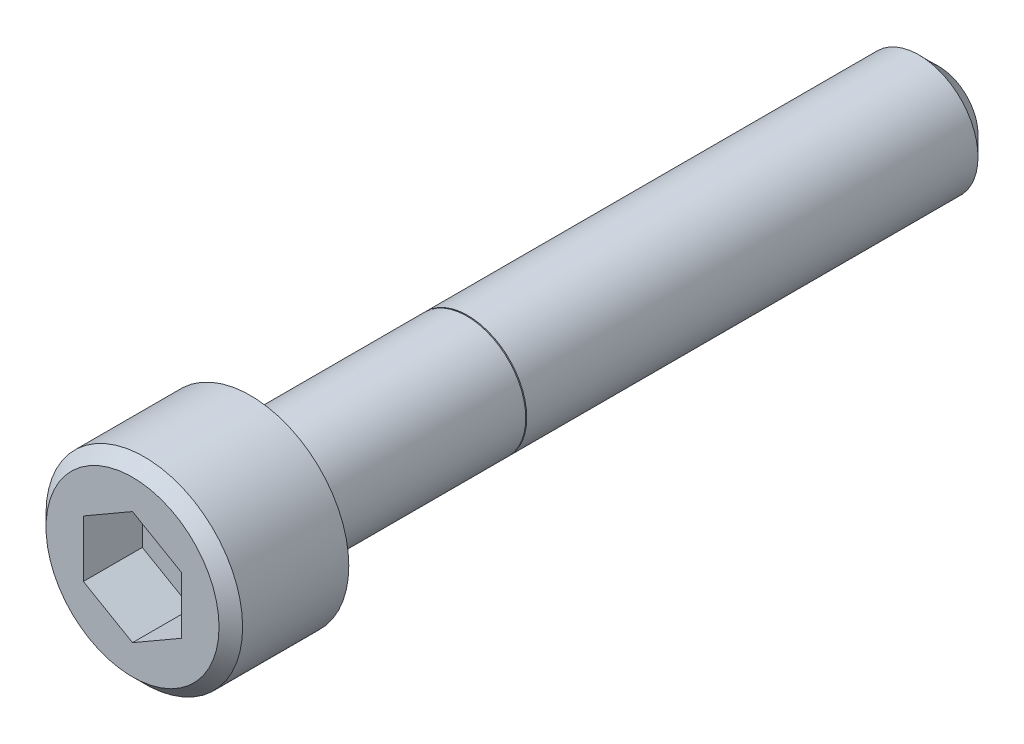
ISO-10303-21;
HEADER;
FILE_DESCRIPTION(('STEP AP214'),'2;1');
FILE_NAME('part.step','',(''),(''),'','','');
FILE_SCHEMA(('AUTOMOTIVE_DESIGN { 1 0 10303 214 1 1 1 1 }'));
ENDSEC;
DATA;
#1=APPLICATION_CONTEXT('core data for automotive mechanical design processes');
#2=APPLICATION_PROTOCOL_DEFINITION('international standard','automotive_design',2000,#1);
#3=PRODUCT_CONTEXT('',#1,'mechanical');
#4=PRODUCT('Part','Part','',(#3));
#5=PRODUCT_RELATED_PRODUCT_CATEGORY('part','',(#4));
#6=PRODUCT_DEFINITION_FORMATION('','',#4);
#7=PRODUCT_DEFINITION_CONTEXT('part definition',#1,'design');
#8=PRODUCT_DEFINITION('design','',#6,#7);
#9=PRODUCT_DEFINITION_SHAPE('','',#8);
#10=(LENGTH_UNIT() NAMED_UNIT(*) SI_UNIT(.MILLI.,.METRE.));
#11=(NAMED_UNIT(*) PLANE_ANGLE_UNIT() SI_UNIT($,.RADIAN.));
#12=(NAMED_UNIT(*) SI_UNIT($,.STERADIAN.) SOLID_ANGLE_UNIT());
#13=UNCERTAINTY_MEASURE_WITH_UNIT(LENGTH_MEASURE(1.E-05),#10,'distance_accuracy_value','');
#14=(GEOMETRIC_REPRESENTATION_CONTEXT(3) GLOBAL_UNCERTAINTY_ASSIGNED_CONTEXT((#13)) GLOBAL_UNIT_ASSIGNED_CONTEXT((#10,
#11,#12)) REPRESENTATION_CONTEXT('',''));
#15=CARTESIAN_POINT('',(0.,0.,0.));
#16=DIRECTION('',(0.,0.,1.));
#17=DIRECTION('',(1.,0.,0.));
#18=AXIS2_PLACEMENT_3D('',#15,#16,#17);
#19=CARTESIAN_POINT('',(0.,0.,54.));
#20=DIRECTION('',(0.,0.,1.));
#21=DIRECTION('',(1.,0.,0.));
#22=AXIS2_PLACEMENT_3D('',#19,#20,#21);
#23=CYLINDRICAL_SURFACE('',#22,3.);
#24=CARTESIAN_POINT('',(0.,0.,0.));
#25=DIRECTION('',(0.,0.,1.));
#26=DIRECTION('',(1.,0.,0.));
#27=AXIS2_PLACEMENT_3D('',#24,#25,#26);
#28=CIRCLE('',#27,3.);
#29=CARTESIAN_POINT('',(3.,0.,0.));
#30=VERTEX_POINT('',#29);
#31=EDGE_CURVE('E135',#30,#30,#28,.T.);
#32=ORIENTED_EDGE('',*,*,#31,.F.);
#33=EDGE_LOOP('',(#32));
#34=FACE_BOUND('',#33,.T.);
#35=CARTESIAN_POINT('',(0.,0.,-11.));
#36=DIRECTION('',(0.,0.,1.));
#37=DIRECTION('',(1.,0.,0.));
#38=AXIS2_PLACEMENT_3D('',#35,#36,#37);
#39=CIRCLE('',#38,3.);
#40=CARTESIAN_POINT('',(3.,0.,-11.));
#41=VERTEX_POINT('',#40);
#42=EDGE_CURVE('E121',#41,#41,#39,.T.);
#43=ORIENTED_EDGE('',*,*,#42,.T.);
#44=EDGE_LOOP('',(#43));
#45=FACE_BOUND('',#44,.T.);
#46=ADVANCED_FACE('F15',(#34,#45),#23,.T.);
#47=CARTESIAN_POINT('',(0.,0.,6.));
#48=DIRECTION('',(0.,0.,1.));
#49=DIRECTION('',(1.,0.,0.));
#50=AXIS2_PLACEMENT_3D('',#47,#48,#49);
#51=PLANE('',#50);
#52=CARTESIAN_POINT('',(0.,0.,6.));
#53=DIRECTION('',(0.,0.,1.));
#54=DIRECTION('',(1.,0.,0.));
#55=AXIS2_PLACEMENT_3D('',#52,#53,#54);
#56=CIRCLE('',#55,4.4);
#57=CARTESIAN_POINT('',(4.4,0.,6.));
#58=VERTEX_POINT('',#57);
#59=EDGE_CURVE('E9',#58,#58,#56,.T.);
#60=ORIENTED_EDGE('',*,*,#59,.T.);
#61=EDGE_LOOP('',(#60));
#62=FACE_BOUND('',#61,.T.);
#63=DIRECTION('',(0.,-1.,0.));
#64=VECTOR('',#63,1.);
#65=CARTESIAN_POINT('',(2.5,1.44337567297406,6.));
#66=LINE('',#65,#64);
#67=CARTESIAN_POINT('',(2.5,1.44337567297406,6.));
#68=VERTEX_POINT('',#67);
#69=CARTESIAN_POINT('',(2.5,-1.44337567297406,6.));
#70=VERTEX_POINT('',#69);
#71=EDGE_CURVE('E102',#68,#70,#66,.T.);
#72=ORIENTED_EDGE('',*,*,#71,.T.);
#73=DIRECTION('',(-0.866025403784439,-0.5,0.));
#74=VECTOR('',#73,1.);
#75=CARTESIAN_POINT('',(2.5,-1.44337567297406,6.));
#76=LINE('',#75,#74);
#77=CARTESIAN_POINT('',(0.,-2.88675134594813,6.));
#78=VERTEX_POINT('',#77);
#79=EDGE_CURVE('E30',#70,#78,#76,.T.);
#80=ORIENTED_EDGE('',*,*,#79,.T.);
#81=DIRECTION('',(-0.866025403784438,0.5,0.));
#82=VECTOR('',#81,1.);
#83=CARTESIAN_POINT('',(0.,-2.88675134594813,6.));
#84=LINE('',#83,#82);
#85=CARTESIAN_POINT('',(-2.49999999999999,-1.44337567297406,6.));
#86=VERTEX_POINT('',#85);
#87=EDGE_CURVE('E103',#78,#86,#84,.T.);
#88=ORIENTED_EDGE('',*,*,#87,.T.);
#89=DIRECTION('',(0.,1.,0.));
#90=VECTOR('',#89,1.);
#91=CARTESIAN_POINT('',(-2.5,-1.44337567297406,6.));
#92=LINE('',#91,#90);
#93=CARTESIAN_POINT('',(-2.5,1.44337567297406,6.));
#94=VERTEX_POINT('',#93);
#95=EDGE_CURVE('E107',#86,#94,#92,.T.);
#96=ORIENTED_EDGE('',*,*,#95,.T.);
#97=DIRECTION('',(0.866025403784439,0.5,0.));
#98=VECTOR('',#97,1.);
#99=CARTESIAN_POINT('',(-2.49999999999999,1.44337567297406,6.));
#100=LINE('',#99,#98);
#101=CARTESIAN_POINT('',(0.,2.88675134594813,6.));
#102=VERTEX_POINT('',#101);
#103=EDGE_CURVE('E111',#94,#102,#100,.T.);
#104=ORIENTED_EDGE('',*,*,#103,.T.);
#105=DIRECTION('',(0.866025403784438,-0.5,0.));
#106=VECTOR('',#105,1.);
#107=CARTESIAN_POINT('',(0.,2.88675134594813,6.));
#108=LINE('',#107,#106);
#109=EDGE_CURVE('E91',#102,#68,#108,.T.);
#110=ORIENTED_EDGE('',*,*,#109,.T.);
#111=EDGE_LOOP('',(#72,#80,#88,#96,#104,#110));
#112=FACE_BOUND('',#111,.T.);
#113=ADVANCED_FACE('F17',(#62,#112),#51,.T.);
#114=CARTESIAN_POINT('',(0.,0.,6.));
#115=DIRECTION('',(0.,0.,-1.));
#116=DIRECTION('',(-1.,0.,0.));
#117=AXIS2_PLACEMENT_3D('',#114,#115,#116);
#118=CONICAL_SURFACE('',#117,4.4,0.785398163397451);
#119=CARTESIAN_POINT('',(0.,0.,5.4));
#120=DIRECTION('',(0.,0.,1.));
#121=DIRECTION('',(1.,0.,0.));
#122=AXIS2_PLACEMENT_3D('',#119,#120,#121);
#123=CIRCLE('',#122,5.);
#124=CARTESIAN_POINT('',(5.,0.,5.4));
#125=VERTEX_POINT('',#124);
#126=EDGE_CURVE('E23',#125,#125,#123,.T.);
#127=ORIENTED_EDGE('',*,*,#126,.T.);
#128=EDGE_LOOP('',(#127));
#129=FACE_BOUND('',#128,.T.);
#130=ORIENTED_EDGE('',*,*,#59,.F.);
#131=EDGE_LOOP('',(#130));
#132=FACE_BOUND('',#131,.T.);
#133=ADVANCED_FACE('F143',(#129,#132),#118,.T.);
#134=CARTESIAN_POINT('',(0.,0.,54.));
#135=DIRECTION('',(0.,0.,1.));
#136=DIRECTION('',(1.,0.,0.));
#137=AXIS2_PLACEMENT_3D('',#134,#135,#136);
#138=CYLINDRICAL_SURFACE('',#137,5.);
#139=CARTESIAN_POINT('',(0.,0.,0.));
#140=DIRECTION('',(0.,0.,1.));
#141=DIRECTION('',(1.,0.,0.));
#142=AXIS2_PLACEMENT_3D('',#139,#140,#141);
#143=CIRCLE('',#142,5.);
#144=CARTESIAN_POINT('',(5.,0.,0.));
#145=VERTEX_POINT('',#144);
#146=EDGE_CURVE('E138',#145,#145,#143,.T.);
#147=ORIENTED_EDGE('',*,*,#146,.T.);
#148=EDGE_LOOP('',(#147));
#149=FACE_BOUND('',#148,.T.);
#150=ORIENTED_EDGE('',*,*,#126,.F.);
#151=EDGE_LOOP('',(#150));
#152=FACE_BOUND('',#151,.T.);
#153=ADVANCED_FACE('F146',(#149,#152),#138,.T.);
#154=CARTESIAN_POINT('',(5.,0.,0.));
#155=DIRECTION('',(0.,0.,-1.));
#156=DIRECTION('',(-1.,0.,0.));
#157=AXIS2_PLACEMENT_3D('',#154,#155,#156);
#158=PLANE('',#157);
#159=ORIENTED_EDGE('',*,*,#31,.T.);
#160=EDGE_LOOP('',(#159));
#161=FACE_BOUND('',#160,.T.);
#162=ORIENTED_EDGE('',*,*,#146,.F.);
#163=EDGE_LOOP('',(#162));
#164=FACE_BOUND('',#163,.T.);
#165=ADVANCED_FACE('F148',(#161,#164),#158,.T.);
#166=CARTESIAN_POINT('',(2.5,-1.44337567297406,3.));
#167=DIRECTION('',(-0.5,0.866025403784438,0.));
#168=DIRECTION('',(-0.866025403784439,-0.5,0.));
#169=AXIS2_PLACEMENT_3D('',#166,#167,#168);
#170=PLANE('',#169);
#171=ORIENTED_EDGE('',*,*,#79,.F.);
#172=DIRECTION('',(0.,0.,1.));
#173=VECTOR('',#172,1.);
#174=CARTESIAN_POINT('',(2.5,-1.44337567297406,3.));
#175=LINE('',#174,#173);
#176=CARTESIAN_POINT('',(2.5,-1.44337567297406,3.));
#177=VERTEX_POINT('',#176);
#178=EDGE_CURVE('E96',#177,#70,#175,.T.);
#179=ORIENTED_EDGE('',*,*,#178,.F.);
#180=DIRECTION('',(-0.866025403784439,-0.5,0.));
#181=VECTOR('',#180,1.);
#182=CARTESIAN_POINT('',(2.5,-1.44337567297406,3.));
#183=LINE('',#182,#181);
#184=CARTESIAN_POINT('',(0.,-2.88675134594813,3.));
#185=VERTEX_POINT('',#184);
#186=EDGE_CURVE('E100',#177,#185,#183,.T.);
#187=ORIENTED_EDGE('',*,*,#186,.T.);
#188=DIRECTION('',(0.,0.,1.));
#189=VECTOR('',#188,1.);
#190=CARTESIAN_POINT('',(0.,-2.88675134594813,3.));
#191=LINE('',#190,#189);
#192=EDGE_CURVE('E127',#185,#78,#191,.T.);
#193=ORIENTED_EDGE('',*,*,#192,.T.);
#194=EDGE_LOOP('',(#171,#179,#187,#193));
#195=FACE_BOUND('',#194,.T.);
#196=ADVANCED_FACE('F156',(#195),#170,.T.);
#197=CARTESIAN_POINT('',(0.,-2.88675134594813,3.));
#198=DIRECTION('',(0.5,0.866025403784438,0.));
#199=DIRECTION('',(-0.866025403784438,0.5,0.));
#200=AXIS2_PLACEMENT_3D('',#197,#198,#199);
#201=PLANE('',#200);
#202=ORIENTED_EDGE('',*,*,#87,.F.);
#203=ORIENTED_EDGE('',*,*,#192,.F.);
#204=DIRECTION('',(-0.866025403784438,0.5,0.));
#205=VECTOR('',#204,1.);
#206=CARTESIAN_POINT('',(0.,-2.88675134594813,3.));
#207=LINE('',#206,#205);
#208=CARTESIAN_POINT('',(-2.49999999999999,-1.44337567297406,3.));
#209=VERTEX_POINT('',#208);
#210=EDGE_CURVE('E69',#185,#209,#207,.T.);
#211=ORIENTED_EDGE('',*,*,#210,.T.);
#212=DIRECTION('',(0.,0.,1.));
#213=VECTOR('',#212,1.);
#214=CARTESIAN_POINT('',(-2.49999999999999,-1.44337567297406,3.));
#215=LINE('',#214,#213);
#216=EDGE_CURVE('E125',#209,#86,#215,.T.);
#217=ORIENTED_EDGE('',*,*,#216,.T.);
#218=EDGE_LOOP('',(#202,#203,#211,#217));
#219=FACE_BOUND('',#218,.T.);
#220=ADVANCED_FACE('F199',(#219),#201,.T.);
#221=CARTESIAN_POINT('',(-2.5,-1.44337567297406,3.));
#222=DIRECTION('',(1.,0.,0.));
#223=DIRECTION('',(0.,0.,-1.));
#224=AXIS2_PLACEMENT_3D('',#221,#222,#223);
#225=PLANE('',#224);
#226=ORIENTED_EDGE('',*,*,#95,.F.);
#227=ORIENTED_EDGE('',*,*,#216,.F.);
#228=DIRECTION('',(0.,1.,0.));
#229=VECTOR('',#228,1.);
#230=CARTESIAN_POINT('',(-2.5,-1.44337567297406,3.));
#231=LINE('',#230,#229);
#232=CARTESIAN_POINT('',(-2.5,1.44337567297406,3.));
#233=VERTEX_POINT('',#232);
#234=EDGE_CURVE('E87',#209,#233,#231,.T.);
#235=ORIENTED_EDGE('',*,*,#234,.T.);
#236=DIRECTION('',(0.,0.,1.));
#237=VECTOR('',#236,1.);
#238=CARTESIAN_POINT('',(-2.5,1.44337567297406,3.));
#239=LINE('',#238,#237);
#240=EDGE_CURVE('E84',#233,#94,#239,.T.);
#241=ORIENTED_EDGE('',*,*,#240,.T.);
#242=EDGE_LOOP('',(#226,#227,#235,#241));
#243=FACE_BOUND('',#242,.T.);
#244=ADVANCED_FACE('F197',(#243),#225,.T.);
#245=CARTESIAN_POINT('',(-2.49999999999999,1.44337567297406,3.));
#246=DIRECTION('',(0.5,-0.866025403784438,0.));
#247=DIRECTION('',(0.866025403784439,0.5,0.));
#248=AXIS2_PLACEMENT_3D('',#245,#246,#247);
#249=PLANE('',#248);
#250=ORIENTED_EDGE('',*,*,#103,.F.);
#251=ORIENTED_EDGE('',*,*,#240,.F.);
#252=DIRECTION('',(0.866025403784439,0.5,0.));
#253=VECTOR('',#252,1.);
#254=CARTESIAN_POINT('',(-2.49999999999999,1.44337567297406,3.));
#255=LINE('',#254,#253);
#256=CARTESIAN_POINT('',(0.,2.88675134594813,3.));
#257=VERTEX_POINT('',#256);
#258=EDGE_CURVE('E79',#233,#257,#255,.T.);
#259=ORIENTED_EDGE('',*,*,#258,.T.);
#260=DIRECTION('',(0.,0.,1.));
#261=VECTOR('',#260,1.);
#262=CARTESIAN_POINT('',(0.,2.88675134594813,3.));
#263=LINE('',#262,#261);
#264=EDGE_CURVE('E83',#257,#102,#263,.T.);
#265=ORIENTED_EDGE('',*,*,#264,.T.);
#266=EDGE_LOOP('',(#250,#251,#259,#265));
#267=FACE_BOUND('',#266,.T.);
#268=ADVANCED_FACE('F82',(#267),#249,.T.);
#269=CARTESIAN_POINT('',(0.,2.88675134594813,3.));
#270=DIRECTION('',(-0.5,-0.866025403784438,0.));
#271=DIRECTION('',(0.866025403784439,-0.5,0.));
#272=AXIS2_PLACEMENT_3D('',#269,#270,#271);
#273=PLANE('',#272);
#274=ORIENTED_EDGE('',*,*,#109,.F.);
#275=ORIENTED_EDGE('',*,*,#264,.F.);
#276=DIRECTION('',(0.866025403784438,-0.5,0.));
#277=VECTOR('',#276,1.);
#278=CARTESIAN_POINT('',(0.,2.88675134594813,3.));
#279=LINE('',#278,#277);
#280=CARTESIAN_POINT('',(2.5,1.44337567297406,3.));
#281=VERTEX_POINT('',#280);
#282=EDGE_CURVE('E86',#257,#281,#279,.T.);
#283=ORIENTED_EDGE('',*,*,#282,.T.);
#284=DIRECTION('',(0.,0.,1.));
#285=VECTOR('',#284,1.);
#286=CARTESIAN_POINT('',(2.5,1.44337567297406,3.));
#287=LINE('',#286,#285);
#288=EDGE_CURVE('E60',#281,#68,#287,.T.);
#289=ORIENTED_EDGE('',*,*,#288,.T.);
#290=EDGE_LOOP('',(#274,#275,#283,#289));
#291=FACE_BOUND('',#290,.T.);
#292=ADVANCED_FACE('F89',(#291),#273,.T.);
#293=CARTESIAN_POINT('',(2.5,1.44337567297406,3.));
#294=DIRECTION('',(-1.,0.,0.));
#295=DIRECTION('',(0.,0.,1.));
#296=AXIS2_PLACEMENT_3D('',#293,#294,#295);
#297=PLANE('',#296);
#298=ORIENTED_EDGE('',*,*,#71,.F.);
#299=ORIENTED_EDGE('',*,*,#288,.F.);
#300=DIRECTION('',(0.,-1.,0.));
#301=VECTOR('',#300,1.);
#302=CARTESIAN_POINT('',(2.5,1.44337567297406,3.));
#303=LINE('',#302,#301);
#304=EDGE_CURVE('E38',#281,#177,#303,.T.);
#305=ORIENTED_EDGE('',*,*,#304,.T.);
#306=ORIENTED_EDGE('',*,*,#178,.T.);
#307=EDGE_LOOP('',(#298,#299,#305,#306));
#308=FACE_BOUND('',#307,.T.);
#309=ADVANCED_FACE('F202',(#308),#297,.T.);
#310=CARTESIAN_POINT('',(0.,-2.88675134594813,3.));
#311=DIRECTION('',(0.,0.,-1.));
#312=DIRECTION('',(-1.,0.,0.));
#313=AXIS2_PLACEMENT_3D('',#310,#311,#312);
#314=PLANE('',#313);
#315=ORIENTED_EDGE('',*,*,#186,.F.);
#316=ORIENTED_EDGE('',*,*,#304,.F.);
#317=ORIENTED_EDGE('',*,*,#282,.F.);
#318=ORIENTED_EDGE('',*,*,#258,.F.);
#319=ORIENTED_EDGE('',*,*,#234,.F.);
#320=ORIENTED_EDGE('',*,*,#210,.F.);
#321=EDGE_LOOP('',(#315,#316,#317,#318,#319,#320));
#322=FACE_BOUND('',#321,.T.);
#323=ADVANCED_FACE('F94',(#322),#314,.F.);
#324=CARTESIAN_POINT('',(-3.,0.,-11.));
#325=DIRECTION('',(0.,0.,-1.));
#326=DIRECTION('',(-1.,0.,0.));
#327=AXIS2_PLACEMENT_3D('',#324,#325,#326);
#328=PLANE('',#327);
#329=CARTESIAN_POINT('',(0.,0.,-11.));
#330=DIRECTION('',(0.,0.,1.));
#331=DIRECTION('',(1.,0.,0.));
#332=AXIS2_PLACEMENT_3D('',#329,#330,#331);
#333=CIRCLE('',#332,2.5);
#334=CARTESIAN_POINT('',(2.5,0.,-11.));
#335=VERTEX_POINT('',#334);
#336=EDGE_CURVE('E187',#335,#335,#333,.T.);
#337=ORIENTED_EDGE('',*,*,#336,.T.);
#338=EDGE_LOOP('',(#337));
#339=FACE_BOUND('',#338,.T.);
#340=ORIENTED_EDGE('',*,*,#42,.F.);
#341=EDGE_LOOP('',(#340));
#342=FACE_BOUND('',#341,.T.);
#343=ADVANCED_FACE('F209',(#339,#342),#328,.T.);
#344=CARTESIAN_POINT('',(0.,0.,54.));
#345=DIRECTION('',(0.,0.,1.));
#346=DIRECTION('',(1.,0.,0.));
#347=AXIS2_PLACEMENT_3D('',#344,#345,#346);
#348=CYLINDRICAL_SURFACE('',#347,2.5);
#349=CARTESIAN_POINT('',(0.,0.,-11.05));
#350=DIRECTION('',(0.,0.,1.));
#351=DIRECTION('',(1.,0.,0.));
#352=AXIS2_PLACEMENT_3D('',#349,#350,#351);
#353=CIRCLE('',#352,2.5);
#354=CARTESIAN_POINT('',(2.5,0.,-11.05));
#355=VERTEX_POINT('',#354);
#356=EDGE_CURVE('E184',#355,#355,#353,.T.);
#357=ORIENTED_EDGE('',*,*,#356,.T.);
#358=EDGE_LOOP('',(#357));
#359=FACE_BOUND('',#358,.T.);
#360=ORIENTED_EDGE('',*,*,#336,.F.);
#361=EDGE_LOOP('',(#360));
#362=FACE_BOUND('',#361,.T.);
#363=ADVANCED_FACE('F228',(#359,#362),#348,.T.);
#364=CARTESIAN_POINT('',(-2.5,0.,-11.05));
#365=DIRECTION('',(0.,0.,1.));
#366=DIRECTION('',(1.,0.,0.));
#367=AXIS2_PLACEMENT_3D('',#364,#365,#366);
#368=PLANE('',#367);
#369=CARTESIAN_POINT('',(0.,0.,-11.05));
#370=DIRECTION('',(0.,0.,1.));
#371=DIRECTION('',(1.,0.,0.));
#372=AXIS2_PLACEMENT_3D('',#369,#370,#371);
#373=CIRCLE('',#372,3.);
#374=CARTESIAN_POINT('',(3.,0.,-11.05));
#375=VERTEX_POINT('',#374);
#376=EDGE_CURVE('E182',#375,#375,#373,.T.);
#377=ORIENTED_EDGE('',*,*,#376,.T.);
#378=EDGE_LOOP('',(#377));
#379=FACE_BOUND('',#378,.T.);
#380=ORIENTED_EDGE('',*,*,#356,.F.);
#381=EDGE_LOOP('',(#380));
#382=FACE_BOUND('',#381,.T.);
#383=ADVANCED_FACE('F223',(#379,#382),#368,.T.);
#384=CARTESIAN_POINT('',(2.,0.,-35.));
#385=DIRECTION('',(0.,0.,-1.));
#386=DIRECTION('',(-1.,0.,0.));
#387=AXIS2_PLACEMENT_3D('',#384,#385,#386);
#388=PLANE('',#387);
#389=CARTESIAN_POINT('',(0.,0.,-35.));
#390=DIRECTION('',(0.,0.,1.));
#391=DIRECTION('',(1.,0.,0.));
#392=AXIS2_PLACEMENT_3D('',#389,#390,#391);
#393=CIRCLE('',#392,2.);
#394=CARTESIAN_POINT('',(2.,0.,-35.));
#395=VERTEX_POINT('',#394);
#396=EDGE_CURVE('E129',#395,#395,#393,.T.);
#397=ORIENTED_EDGE('',*,*,#396,.F.);
#398=EDGE_LOOP('',(#397));
#399=FACE_BOUND('',#398,.T.);
#400=ADVANCED_FACE('F176',(#399),#388,.T.);
#401=CARTESIAN_POINT('',(0.,0.,-34.));
#402=DIRECTION('',(0.,0.,1.));
#403=DIRECTION('',(1.,0.,0.));
#404=AXIS2_PLACEMENT_3D('',#401,#402,#403);
#405=CONICAL_SURFACE('',#404,3.,0.785398163397448);
#406=ORIENTED_EDGE('',*,*,#396,.T.);
#407=EDGE_LOOP('',(#406));
#408=FACE_BOUND('',#407,.T.);
#409=CARTESIAN_POINT('',(0.,0.,-34.));
#410=DIRECTION('',(0.,0.,1.));
#411=DIRECTION('',(1.,0.,0.));
#412=AXIS2_PLACEMENT_3D('',#409,#410,#411);
#413=CIRCLE('',#412,3.);
#414=CARTESIAN_POINT('',(3.,0.,-34.));
#415=VERTEX_POINT('',#414);
#416=EDGE_CURVE('E132',#415,#415,#413,.T.);
#417=ORIENTED_EDGE('',*,*,#416,.F.);
#418=EDGE_LOOP('',(#417));
#419=FACE_BOUND('',#418,.T.);
#420=ADVANCED_FACE('F171',(#408,#419),#405,.T.);
#421=ORIENTED_EDGE('',*,*,#416,.T.);
#422=EDGE_LOOP('',(#421));
#423=FACE_BOUND('',#422,.T.);
#424=ORIENTED_EDGE('',*,*,#376,.F.);
#425=EDGE_LOOP('',(#424));
#426=FACE_BOUND('',#425,.T.);
#427=ADVANCED_FACE('F162',(#423,#426),#23,.T.);
#428=CLOSED_SHELL('',(#46,#113,#133,#153,#165,#196,#220,#244,#268,#292,#309,#323,#343,#363,#383,
#400,#420,#427));
#429=MANIFOLD_SOLID_BREP('B1',#428);
#430=ADVANCED_BREP_SHAPE_REPRESENTATION('',(#18,#429),#14);
#431=SHAPE_DEFINITION_REPRESENTATION(#9,#430);
ENDSEC;
END-ISO-10303-21;
